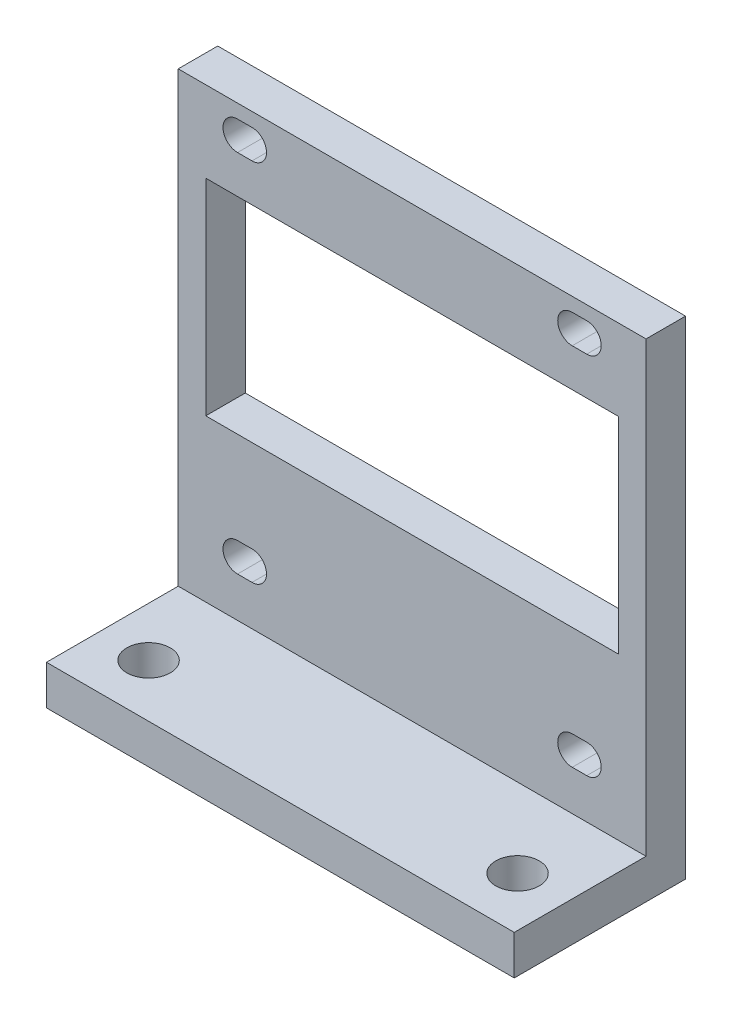
ISO-10303-21;
HEADER;
FILE_DESCRIPTION(('STEP AP214'),'2;1');
FILE_NAME('part.step','',(''),(''),'','','');
FILE_SCHEMA(('AUTOMOTIVE_DESIGN { 1 0 10303 214 1 1 1 1 }'));
ENDSEC;
DATA;
#1=APPLICATION_CONTEXT('core data for automotive mechanical design processes');
#2=APPLICATION_PROTOCOL_DEFINITION('international standard','automotive_design',2000,#1);
#3=PRODUCT_CONTEXT('',#1,'mechanical');
#4=PRODUCT('Part','Part','',(#3));
#5=PRODUCT_RELATED_PRODUCT_CATEGORY('part','',(#4));
#6=PRODUCT_DEFINITION_FORMATION('','',#4);
#7=PRODUCT_DEFINITION_CONTEXT('part definition',#1,'design');
#8=PRODUCT_DEFINITION('design','',#6,#7);
#9=PRODUCT_DEFINITION_SHAPE('','',#8);
#10=(LENGTH_UNIT() NAMED_UNIT(*) SI_UNIT(.MILLI.,.METRE.));
#11=(NAMED_UNIT(*) PLANE_ANGLE_UNIT() SI_UNIT($,.RADIAN.));
#12=(NAMED_UNIT(*) SI_UNIT($,.STERADIAN.) SOLID_ANGLE_UNIT());
#13=UNCERTAINTY_MEASURE_WITH_UNIT(LENGTH_MEASURE(1.E-05),#10,'distance_accuracy_value','');
#14=(GEOMETRIC_REPRESENTATION_CONTEXT(3) GLOBAL_UNCERTAINTY_ASSIGNED_CONTEXT((#13)) GLOBAL_UNIT_ASSIGNED_CONTEXT((#10,
#11,#12)) REPRESENTATION_CONTEXT('',''));
#15=CARTESIAN_POINT('',(0.,0.,0.));
#16=DIRECTION('',(0.,0.,1.));
#17=DIRECTION('',(1.,0.,0.));
#18=AXIS2_PLACEMENT_3D('',#15,#16,#17);
#19=CARTESIAN_POINT('',(0.,0.,3.));
#20=DIRECTION('',(0.,0.,-1.));
#21=DIRECTION('',(-1.,0.,0.));
#22=AXIS2_PLACEMENT_3D('',#19,#20,#21);
#23=PLANE('',#22);
#24=CARTESIAN_POINT('',(29.9000000000003,7.15000000000001,3.));
#25=DIRECTION('',(0.,0.,1.));
#26=DIRECTION('',(1.,0.,0.));
#27=AXIS2_PLACEMENT_3D('',#24,#25,#26);
#28=CIRCLE('',#27,1.1);
#29=CARTESIAN_POINT('',(29.9000000000003,8.25,3.));
#30=VERTEX_POINT('',#29);
#31=CARTESIAN_POINT('',(29.9000000000003,6.05000000000001,3.));
#32=VERTEX_POINT('',#31);
#33=EDGE_CURVE('E347',#30,#32,#28,.T.);
#34=ORIENTED_EDGE('',*,*,#33,.F.);
#35=DIRECTION('',(-1.,0.,0.));
#36=VECTOR('',#35,1.);
#37=CARTESIAN_POINT('',(29.9000000000003,8.25,3.));
#38=LINE('',#37,#36);
#39=CARTESIAN_POINT('',(31.0000000000003,8.25000000000001,3.));
#40=VERTEX_POINT('',#39);
#41=EDGE_CURVE('E360',#40,#30,#38,.T.);
#42=ORIENTED_EDGE('',*,*,#41,.F.);
#43=CARTESIAN_POINT('',(31.0000000000003,7.15000000000001,3.));
#44=DIRECTION('',(0.,0.,1.));
#45=DIRECTION('',(1.,0.,0.));
#46=AXIS2_PLACEMENT_3D('',#43,#44,#45);
#47=CIRCLE('',#46,1.1);
#48=CARTESIAN_POINT('',(31.0000000000003,6.05,3.));
#49=VERTEX_POINT('',#48);
#50=EDGE_CURVE('E354',#49,#40,#47,.T.);
#51=ORIENTED_EDGE('',*,*,#50,.F.);
#52=DIRECTION('',(1.,0.,0.));
#53=VECTOR('',#52,1.);
#54=CARTESIAN_POINT('',(29.9000000000003,6.05000000000001,3.));
#55=LINE('',#54,#53);
#56=EDGE_CURVE('E349',#32,#49,#55,.T.);
#57=ORIENTED_EDGE('',*,*,#56,.F.);
#58=EDGE_LOOP('',(#34,#42,#51,#57));
#59=FACE_BOUND('',#58,.T.);
#60=DIRECTION('',(0.,-1.,0.));
#61=VECTOR('',#60,1.);
#62=CARTESIAN_POINT('',(2.09,15.24,3.));
#63=LINE('',#62,#61);
#64=CARTESIAN_POINT('',(2.09,30.86,3.));
#65=VERTEX_POINT('',#64);
#66=CARTESIAN_POINT('',(2.09,15.24,3.));
#67=VERTEX_POINT('',#66);
#68=EDGE_CURVE('E435',#65,#67,#63,.T.);
#69=ORIENTED_EDGE('',*,*,#68,.F.);
#70=DIRECTION('',(-1.,0.,0.));
#71=VECTOR('',#70,1.);
#72=CARTESIAN_POINT('',(2.09,30.86,3.));
#73=LINE('',#72,#71);
#74=CARTESIAN_POINT('',(33.41,30.86,3.));
#75=VERTEX_POINT('',#74);
#76=EDGE_CURVE('E444',#75,#65,#73,.T.);
#77=ORIENTED_EDGE('',*,*,#76,.F.);
#78=DIRECTION('',(0.,1.,0.));
#79=VECTOR('',#78,1.);
#80=CARTESIAN_POINT('',(33.41,15.24,3.));
#81=LINE('',#80,#79);
#82=CARTESIAN_POINT('',(33.41,15.24,3.));
#83=VERTEX_POINT('',#82);
#84=EDGE_CURVE('E438',#83,#75,#81,.T.);
#85=ORIENTED_EDGE('',*,*,#84,.F.);
#86=DIRECTION('',(1.,0.,0.));
#87=VECTOR('',#86,1.);
#88=CARTESIAN_POINT('',(2.09,15.24,3.));
#89=LINE('',#88,#87);
#90=EDGE_CURVE('E434',#67,#83,#89,.T.);
#91=ORIENTED_EDGE('',*,*,#90,.F.);
#92=EDGE_LOOP('',(#69,#77,#85,#91));
#93=FACE_BOUND('',#92,.T.);
#94=DIRECTION('',(0.,-1.,0.));
#95=VECTOR('',#94,1.);
#96=CARTESIAN_POINT('',(0.,0.,3.));
#97=LINE('',#96,#95);
#98=CARTESIAN_POINT('',(0.,37.,3.));
#99=VERTEX_POINT('',#98);
#100=CARTESIAN_POINT('',(0.,3.,3.));
#101=VERTEX_POINT('',#100);
#102=EDGE_CURVE('E235',#99,#101,#97,.T.);
#103=ORIENTED_EDGE('',*,*,#102,.T.);
#104=DIRECTION('',(1.,0.,0.));
#105=VECTOR('',#104,1.);
#106=CARTESIAN_POINT('',(0.,3.,3.));
#107=LINE('',#106,#105);
#108=CARTESIAN_POINT('',(35.5,3.,3.));
#109=VERTEX_POINT('',#108);
#110=EDGE_CURVE('E217',#101,#109,#107,.T.);
#111=ORIENTED_EDGE('',*,*,#110,.T.);
#112=DIRECTION('',(0.,1.,0.));
#113=VECTOR('',#112,1.);
#114=CARTESIAN_POINT('',(35.5,0.,3.));
#115=LINE('',#114,#113);
#116=CARTESIAN_POINT('',(35.5,37.,3.));
#117=VERTEX_POINT('',#116);
#118=EDGE_CURVE('E249',#109,#117,#115,.T.);
#119=ORIENTED_EDGE('',*,*,#118,.T.);
#120=DIRECTION('',(-1.,0.,0.));
#121=VECTOR('',#120,1.);
#122=CARTESIAN_POINT('',(0.,37.,3.));
#123=LINE('',#122,#121);
#124=EDGE_CURVE('E238',#117,#99,#123,.T.);
#125=ORIENTED_EDGE('',*,*,#124,.T.);
#126=EDGE_LOOP('',(#103,#111,#119,#125));
#127=FACE_BOUND('',#126,.T.);
#128=CARTESIAN_POINT('',(4.5,34.85,3.));
#129=DIRECTION('',(0.,0.,1.));
#130=DIRECTION('',(1.,0.,0.));
#131=AXIS2_PLACEMENT_3D('',#128,#129,#130);
#132=CIRCLE('',#131,1.1);
#133=CARTESIAN_POINT('',(4.5,35.95,3.));
#134=VERTEX_POINT('',#133);
#135=CARTESIAN_POINT('',(4.5,33.75,3.));
#136=VERTEX_POINT('',#135);
#137=EDGE_CURVE('E474',#134,#136,#132,.T.);
#138=ORIENTED_EDGE('',*,*,#137,.F.);
#139=DIRECTION('',(-1.,0.,0.));
#140=VECTOR('',#139,1.);
#141=CARTESIAN_POINT('',(4.5,35.95,3.));
#142=LINE('',#141,#140);
#143=CARTESIAN_POINT('',(5.6,35.95,3.));
#144=VERTEX_POINT('',#143);
#145=EDGE_CURVE('E486',#144,#134,#142,.T.);
#146=ORIENTED_EDGE('',*,*,#145,.F.);
#147=CARTESIAN_POINT('',(5.6,34.85,3.));
#148=DIRECTION('',(0.,0.,1.));
#149=DIRECTION('',(1.,0.,0.));
#150=AXIS2_PLACEMENT_3D('',#147,#148,#149);
#151=CIRCLE('',#150,1.1);
#152=CARTESIAN_POINT('',(5.59999999999999,33.75,3.));
#153=VERTEX_POINT('',#152);
#154=EDGE_CURVE('E485',#153,#144,#151,.T.);
#155=ORIENTED_EDGE('',*,*,#154,.F.);
#156=DIRECTION('',(1.,0.,0.));
#157=VECTOR('',#156,1.);
#158=CARTESIAN_POINT('',(4.5,33.75,3.));
#159=LINE('',#158,#157);
#160=EDGE_CURVE('E476',#136,#153,#159,.T.);
#161=ORIENTED_EDGE('',*,*,#160,.F.);
#162=EDGE_LOOP('',(#138,#146,#155,#161));
#163=FACE_BOUND('',#162,.T.);
#164=CARTESIAN_POINT('',(29.9,34.85,3.));
#165=DIRECTION('',(0.,0.,1.));
#166=DIRECTION('',(1.,0.,0.));
#167=AXIS2_PLACEMENT_3D('',#164,#165,#166);
#168=CIRCLE('',#167,1.1);
#169=CARTESIAN_POINT('',(29.9,35.95,3.));
#170=VERTEX_POINT('',#169);
#171=CARTESIAN_POINT('',(29.9,33.75,3.));
#172=VERTEX_POINT('',#171);
#173=EDGE_CURVE('E386',#170,#172,#168,.T.);
#174=ORIENTED_EDGE('',*,*,#173,.F.);
#175=DIRECTION('',(-1.,0.,0.));
#176=VECTOR('',#175,1.);
#177=CARTESIAN_POINT('',(29.9,35.95,3.));
#178=LINE('',#177,#176);
#179=CARTESIAN_POINT('',(31.,35.95,3.));
#180=VERTEX_POINT('',#179);
#181=EDGE_CURVE('E399',#180,#170,#178,.T.);
#182=ORIENTED_EDGE('',*,*,#181,.F.);
#183=CARTESIAN_POINT('',(31.,34.85,3.));
#184=DIRECTION('',(0.,0.,1.));
#185=DIRECTION('',(1.,0.,0.));
#186=AXIS2_PLACEMENT_3D('',#183,#184,#185);
#187=CIRCLE('',#186,1.10000000000001);
#188=CARTESIAN_POINT('',(31.,33.75,3.));
#189=VERTEX_POINT('',#188);
#190=EDGE_CURVE('E396',#189,#180,#187,.T.);
#191=ORIENTED_EDGE('',*,*,#190,.F.);
#192=DIRECTION('',(1.,0.,0.));
#193=VECTOR('',#192,1.);
#194=CARTESIAN_POINT('',(29.9,33.75,3.));
#195=LINE('',#194,#193);
#196=EDGE_CURVE('E395',#172,#189,#195,.T.);
#197=ORIENTED_EDGE('',*,*,#196,.F.);
#198=EDGE_LOOP('',(#174,#182,#191,#197));
#199=FACE_BOUND('',#198,.T.);
#200=CARTESIAN_POINT('',(4.50000000000029,7.15000000000001,3.));
#201=DIRECTION('',(0.,0.,1.));
#202=DIRECTION('',(1.,0.,0.));
#203=AXIS2_PLACEMENT_3D('',#200,#201,#202);
#204=CIRCLE('',#203,1.1);
#205=CARTESIAN_POINT('',(4.50000000000029,8.25,3.));
#206=VERTEX_POINT('',#205);
#207=CARTESIAN_POINT('',(4.50000000000029,6.05000000000001,3.));
#208=VERTEX_POINT('',#207);
#209=EDGE_CURVE('E304',#206,#208,#204,.T.);
#210=ORIENTED_EDGE('',*,*,#209,.F.);
#211=DIRECTION('',(-1.,0.,0.));
#212=VECTOR('',#211,1.);
#213=CARTESIAN_POINT('',(4.50000000000029,8.25,3.));
#214=LINE('',#213,#212);
#215=CARTESIAN_POINT('',(5.60000000000029,8.25000000000001,3.));
#216=VERTEX_POINT('',#215);
#217=EDGE_CURVE('E312',#216,#206,#214,.T.);
#218=ORIENTED_EDGE('',*,*,#217,.F.);
#219=CARTESIAN_POINT('',(5.60000000000029,7.15000000000001,3.));
#220=DIRECTION('',(0.,0.,1.));
#221=DIRECTION('',(1.,0.,0.));
#222=AXIS2_PLACEMENT_3D('',#219,#220,#221);
#223=CIRCLE('',#222,1.1);
#224=CARTESIAN_POINT('',(5.60000000000029,6.05,3.));
#225=VERTEX_POINT('',#224);
#226=EDGE_CURVE('E315',#225,#216,#223,.T.);
#227=ORIENTED_EDGE('',*,*,#226,.F.);
#228=DIRECTION('',(1.,0.,0.));
#229=VECTOR('',#228,1.);
#230=CARTESIAN_POINT('',(4.50000000000029,6.05000000000001,3.));
#231=LINE('',#230,#229);
#232=EDGE_CURVE('E306',#208,#225,#231,.T.);
#233=ORIENTED_EDGE('',*,*,#232,.F.);
#234=EDGE_LOOP('',(#210,#218,#227,#233));
#235=FACE_BOUND('',#234,.T.);
#236=ADVANCED_FACE('F44',(#59,#93,#127,#163,#199,#235),#23,.F.);
#237=CARTESIAN_POINT('',(0.,0.,0.));
#238=DIRECTION('',(0.,0.,-1.));
#239=DIRECTION('',(-1.,0.,0.));
#240=AXIS2_PLACEMENT_3D('',#237,#238,#239);
#241=PLANE('',#240);
#242=DIRECTION('',(0.,1.,0.));
#243=VECTOR('',#242,1.);
#244=CARTESIAN_POINT('',(35.5,0.,0.));
#245=LINE('',#244,#243);
#246=CARTESIAN_POINT('',(35.5,0.,0.));
#247=VERTEX_POINT('',#246);
#248=CARTESIAN_POINT('',(35.5,37.,0.));
#249=VERTEX_POINT('',#248);
#250=EDGE_CURVE('E255',#247,#249,#245,.T.);
#251=ORIENTED_EDGE('',*,*,#250,.F.);
#252=DIRECTION('',(1.,0.,0.));
#253=VECTOR('',#252,1.);
#254=CARTESIAN_POINT('',(0.,0.,0.));
#255=LINE('',#254,#253);
#256=CARTESIAN_POINT('',(0.,0.,0.));
#257=VERTEX_POINT('',#256);
#258=EDGE_CURVE('E264',#257,#247,#255,.T.);
#259=ORIENTED_EDGE('',*,*,#258,.F.);
#260=DIRECTION('',(0.,-1.,0.));
#261=VECTOR('',#260,1.);
#262=CARTESIAN_POINT('',(0.,0.,0.));
#263=LINE('',#262,#261);
#264=CARTESIAN_POINT('',(0.,37.,0.));
#265=VERTEX_POINT('',#264);
#266=EDGE_CURVE('E265',#265,#257,#263,.T.);
#267=ORIENTED_EDGE('',*,*,#266,.F.);
#268=DIRECTION('',(-1.,0.,0.));
#269=VECTOR('',#268,1.);
#270=CARTESIAN_POINT('',(0.,37.,0.));
#271=LINE('',#270,#269);
#272=EDGE_CURVE('E256',#249,#265,#271,.T.);
#273=ORIENTED_EDGE('',*,*,#272,.F.);
#274=EDGE_LOOP('',(#251,#259,#267,#273));
#275=FACE_BOUND('',#274,.T.);
#276=DIRECTION('',(-1.,0.,0.));
#277=VECTOR('',#276,1.);
#278=CARTESIAN_POINT('',(4.5,35.95,0.));
#279=LINE('',#278,#277);
#280=CARTESIAN_POINT('',(5.6,35.95,0.));
#281=VERTEX_POINT('',#280);
#282=CARTESIAN_POINT('',(4.5,35.95,0.));
#283=VERTEX_POINT('',#282);
#284=EDGE_CURVE('E479',#281,#283,#279,.T.);
#285=ORIENTED_EDGE('',*,*,#284,.T.);
#286=CARTESIAN_POINT('',(4.5,34.85,0.));
#287=DIRECTION('',(0.,0.,1.));
#288=DIRECTION('',(1.,0.,0.));
#289=AXIS2_PLACEMENT_3D('',#286,#287,#288);
#290=CIRCLE('',#289,1.1);
#291=CARTESIAN_POINT('',(4.5,33.75,0.));
#292=VERTEX_POINT('',#291);
#293=EDGE_CURVE('E475',#283,#292,#290,.T.);
#294=ORIENTED_EDGE('',*,*,#293,.T.);
#295=DIRECTION('',(1.,0.,0.));
#296=VECTOR('',#295,1.);
#297=CARTESIAN_POINT('',(4.5,33.75,0.));
#298=LINE('',#297,#296);
#299=CARTESIAN_POINT('',(5.59999999999999,33.75,0.));
#300=VERTEX_POINT('',#299);
#301=EDGE_CURVE('E492',#292,#300,#298,.T.);
#302=ORIENTED_EDGE('',*,*,#301,.T.);
#303=CARTESIAN_POINT('',(5.6,34.85,0.));
#304=DIRECTION('',(0.,0.,1.));
#305=DIRECTION('',(1.,0.,0.));
#306=AXIS2_PLACEMENT_3D('',#303,#304,#305);
#307=CIRCLE('',#306,1.1);
#308=EDGE_CURVE('E500',#300,#281,#307,.T.);
#309=ORIENTED_EDGE('',*,*,#308,.T.);
#310=EDGE_LOOP('',(#285,#294,#302,#309));
#311=FACE_BOUND('',#310,.T.);
#312=DIRECTION('',(-1.,0.,0.));
#313=VECTOR('',#312,1.);
#314=CARTESIAN_POINT('',(2.09,30.86,0.));
#315=LINE('',#314,#313);
#316=CARTESIAN_POINT('',(33.41,30.86,0.));
#317=VERTEX_POINT('',#316);
#318=CARTESIAN_POINT('',(2.09,30.86,0.));
#319=VERTEX_POINT('',#318);
#320=EDGE_CURVE('E436',#317,#319,#315,.T.);
#321=ORIENTED_EDGE('',*,*,#320,.T.);
#322=DIRECTION('',(0.,-1.,0.));
#323=VECTOR('',#322,1.);
#324=CARTESIAN_POINT('',(2.09,15.24,0.));
#325=LINE('',#324,#323);
#326=CARTESIAN_POINT('',(2.09,15.24,0.));
#327=VERTEX_POINT('',#326);
#328=EDGE_CURVE('E431',#319,#327,#325,.T.);
#329=ORIENTED_EDGE('',*,*,#328,.T.);
#330=DIRECTION('',(1.,0.,0.));
#331=VECTOR('',#330,1.);
#332=CARTESIAN_POINT('',(2.09,15.24,0.));
#333=LINE('',#332,#331);
#334=CARTESIAN_POINT('',(33.41,15.24,0.));
#335=VERTEX_POINT('',#334);
#336=EDGE_CURVE('E448',#327,#335,#333,.T.);
#337=ORIENTED_EDGE('',*,*,#336,.T.);
#338=DIRECTION('',(0.,1.,0.));
#339=VECTOR('',#338,1.);
#340=CARTESIAN_POINT('',(33.41,15.24,0.));
#341=LINE('',#340,#339);
#342=EDGE_CURVE('E452',#335,#317,#341,.T.);
#343=ORIENTED_EDGE('',*,*,#342,.T.);
#344=EDGE_LOOP('',(#321,#329,#337,#343));
#345=FACE_BOUND('',#344,.T.);
#346=DIRECTION('',(-1.,0.,0.));
#347=VECTOR('',#346,1.);
#348=CARTESIAN_POINT('',(29.9,35.95,0.));
#349=LINE('',#348,#347);
#350=CARTESIAN_POINT('',(31.,35.95,0.));
#351=VERTEX_POINT('',#350);
#352=CARTESIAN_POINT('',(29.9,35.95,0.));
#353=VERTEX_POINT('',#352);
#354=EDGE_CURVE('E394',#351,#353,#349,.T.);
#355=ORIENTED_EDGE('',*,*,#354,.T.);
#356=CARTESIAN_POINT('',(29.9,34.85,0.));
#357=DIRECTION('',(0.,0.,1.));
#358=DIRECTION('',(1.,0.,0.));
#359=AXIS2_PLACEMENT_3D('',#356,#357,#358);
#360=CIRCLE('',#359,1.1);
#361=CARTESIAN_POINT('',(29.9,33.75,0.));
#362=VERTEX_POINT('',#361);
#363=EDGE_CURVE('E389',#353,#362,#360,.T.);
#364=ORIENTED_EDGE('',*,*,#363,.T.);
#365=DIRECTION('',(1.,0.,0.));
#366=VECTOR('',#365,1.);
#367=CARTESIAN_POINT('',(29.9,33.75,0.));
#368=LINE('',#367,#366);
#369=CARTESIAN_POINT('',(31.,33.75,0.));
#370=VERTEX_POINT('',#369);
#371=EDGE_CURVE('E410',#362,#370,#368,.T.);
#372=ORIENTED_EDGE('',*,*,#371,.T.);
#373=CARTESIAN_POINT('',(31.,34.85,0.));
#374=DIRECTION('',(0.,0.,1.));
#375=DIRECTION('',(1.,0.,0.));
#376=AXIS2_PLACEMENT_3D('',#373,#374,#375);
#377=CIRCLE('',#376,1.10000000000001);
#378=EDGE_CURVE('E411',#370,#351,#377,.T.);
#379=ORIENTED_EDGE('',*,*,#378,.T.);
#380=EDGE_LOOP('',(#355,#364,#372,#379));
#381=FACE_BOUND('',#380,.T.);
#382=DIRECTION('',(-1.,0.,0.));
#383=VECTOR('',#382,1.);
#384=CARTESIAN_POINT('',(29.9000000000003,8.25,0.));
#385=LINE('',#384,#383);
#386=CARTESIAN_POINT('',(31.0000000000003,8.25000000000001,0.));
#387=VERTEX_POINT('',#386);
#388=CARTESIAN_POINT('',(29.9000000000003,8.25,0.));
#389=VERTEX_POINT('',#388);
#390=EDGE_CURVE('E348',#387,#389,#385,.T.);
#391=ORIENTED_EDGE('',*,*,#390,.T.);
#392=CARTESIAN_POINT('',(29.9000000000003,7.15000000000001,0.));
#393=DIRECTION('',(0.,0.,1.));
#394=DIRECTION('',(1.,0.,0.));
#395=AXIS2_PLACEMENT_3D('',#392,#393,#394);
#396=CIRCLE('',#395,1.1);
#397=CARTESIAN_POINT('',(29.9000000000003,6.05000000000001,0.));
#398=VERTEX_POINT('',#397);
#399=EDGE_CURVE('E344',#389,#398,#396,.T.);
#400=ORIENTED_EDGE('',*,*,#399,.T.);
#401=DIRECTION('',(1.,0.,0.));
#402=VECTOR('',#401,1.);
#403=CARTESIAN_POINT('',(29.9000000000003,6.05000000000001,0.));
#404=LINE('',#403,#402);
#405=CARTESIAN_POINT('',(31.0000000000003,6.05,0.));
#406=VERTEX_POINT('',#405);
#407=EDGE_CURVE('E365',#398,#406,#404,.T.);
#408=ORIENTED_EDGE('',*,*,#407,.T.);
#409=CARTESIAN_POINT('',(31.0000000000003,7.15000000000001,0.));
#410=DIRECTION('',(0.,0.,1.));
#411=DIRECTION('',(1.,0.,0.));
#412=AXIS2_PLACEMENT_3D('',#409,#410,#411);
#413=CIRCLE('',#412,1.1);
#414=EDGE_CURVE('E366',#406,#387,#413,.T.);
#415=ORIENTED_EDGE('',*,*,#414,.T.);
#416=EDGE_LOOP('',(#391,#400,#408,#415));
#417=FACE_BOUND('',#416,.T.);
#418=DIRECTION('',(-1.,0.,0.));
#419=VECTOR('',#418,1.);
#420=CARTESIAN_POINT('',(4.50000000000029,8.25,0.));
#421=LINE('',#420,#419);
#422=CARTESIAN_POINT('',(5.60000000000029,8.25000000000001,0.));
#423=VERTEX_POINT('',#422);
#424=CARTESIAN_POINT('',(4.50000000000029,8.25,0.));
#425=VERTEX_POINT('',#424);
#426=EDGE_CURVE('E310',#423,#425,#421,.T.);
#427=ORIENTED_EDGE('',*,*,#426,.T.);
#428=CARTESIAN_POINT('',(4.50000000000029,7.15000000000001,0.));
#429=DIRECTION('',(0.,0.,1.));
#430=DIRECTION('',(1.,0.,0.));
#431=AXIS2_PLACEMENT_3D('',#428,#429,#430);
#432=CIRCLE('',#431,1.1);
#433=CARTESIAN_POINT('',(4.50000000000029,6.05000000000001,0.));
#434=VERTEX_POINT('',#433);
#435=EDGE_CURVE('E303',#425,#434,#432,.T.);
#436=ORIENTED_EDGE('',*,*,#435,.T.);
#437=DIRECTION('',(1.,0.,0.));
#438=VECTOR('',#437,1.);
#439=CARTESIAN_POINT('',(4.50000000000029,6.05000000000001,0.));
#440=LINE('',#439,#438);
#441=CARTESIAN_POINT('',(5.60000000000029,6.05,0.));
#442=VERTEX_POINT('',#441);
#443=EDGE_CURVE('E325',#434,#442,#440,.T.);
#444=ORIENTED_EDGE('',*,*,#443,.T.);
#445=CARTESIAN_POINT('',(5.60000000000029,7.15000000000001,0.));
#446=DIRECTION('',(0.,0.,1.));
#447=DIRECTION('',(1.,0.,0.));
#448=AXIS2_PLACEMENT_3D('',#445,#446,#447);
#449=CIRCLE('',#448,1.1);
#450=EDGE_CURVE('E326',#442,#423,#449,.T.);
#451=ORIENTED_EDGE('',*,*,#450,.T.);
#452=EDGE_LOOP('',(#427,#436,#444,#451));
#453=FACE_BOUND('',#452,.T.);
#454=ADVANCED_FACE('F277',(#275,#311,#345,#381,#417,#453),#241,.T.);
#455=CARTESIAN_POINT('',(35.5,0.,3.));
#456=DIRECTION('',(-1.,0.,0.));
#457=DIRECTION('',(0.,-1.,0.));
#458=AXIS2_PLACEMENT_3D('',#455,#456,#457);
#459=PLANE('',#458);
#460=ORIENTED_EDGE('',*,*,#250,.T.);
#461=DIRECTION('',(0.,0.,-1.));
#462=VECTOR('',#461,1.);
#463=CARTESIAN_POINT('',(35.5,37.,3.));
#464=LINE('',#463,#462);
#465=EDGE_CURVE('E11',#117,#249,#464,.T.);
#466=ORIENTED_EDGE('',*,*,#465,.F.);
#467=ORIENTED_EDGE('',*,*,#118,.F.);
#468=DIRECTION('',(0.,0.,1.));
#469=VECTOR('',#468,1.);
#470=CARTESIAN_POINT('',(35.5,3.,3.));
#471=LINE('',#470,#469);
#472=CARTESIAN_POINT('',(35.5,3.,13.));
#473=VERTEX_POINT('',#472);
#474=EDGE_CURVE('E62',#109,#473,#471,.T.);
#475=ORIENTED_EDGE('',*,*,#474,.T.);
#476=DIRECTION('',(0.,-1.,0.));
#477=VECTOR('',#476,1.);
#478=CARTESIAN_POINT('',(35.5,3.,13.));
#479=LINE('',#478,#477);
#480=CARTESIAN_POINT('',(35.5,0.,13.));
#481=VERTEX_POINT('',#480);
#482=EDGE_CURVE('E283',#473,#481,#479,.T.);
#483=ORIENTED_EDGE('',*,*,#482,.T.);
#484=DIRECTION('',(0.,0.,-1.));
#485=VECTOR('',#484,1.);
#486=CARTESIAN_POINT('',(35.5,0.,3.));
#487=LINE('',#486,#485);
#488=EDGE_CURVE('E244',#481,#247,#487,.T.);
#489=ORIENTED_EDGE('',*,*,#488,.T.);
#490=EDGE_LOOP('',(#460,#466,#467,#475,#483,#489));
#491=FACE_BOUND('',#490,.T.);
#492=ADVANCED_FACE('F50',(#491),#459,.F.);
#493=CARTESIAN_POINT('',(0.,37.,3.));
#494=DIRECTION('',(0.,-1.,0.));
#495=DIRECTION('',(0.,0.,-1.));
#496=AXIS2_PLACEMENT_3D('',#493,#494,#495);
#497=PLANE('',#496);
#498=ORIENTED_EDGE('',*,*,#272,.T.);
#499=DIRECTION('',(0.,0.,-1.));
#500=VECTOR('',#499,1.);
#501=CARTESIAN_POINT('',(0.,37.,3.));
#502=LINE('',#501,#500);
#503=EDGE_CURVE('E53',#99,#265,#502,.T.);
#504=ORIENTED_EDGE('',*,*,#503,.F.);
#505=ORIENTED_EDGE('',*,*,#124,.F.);
#506=ORIENTED_EDGE('',*,*,#465,.T.);
#507=EDGE_LOOP('',(#498,#504,#505,#506));
#508=FACE_BOUND('',#507,.T.);
#509=ADVANCED_FACE('F517',(#508),#497,.F.);
#510=CARTESIAN_POINT('',(0.,0.,3.));
#511=DIRECTION('',(1.,0.,0.));
#512=DIRECTION('',(0.,0.,-1.));
#513=AXIS2_PLACEMENT_3D('',#510,#511,#512);
#514=PLANE('',#513);
#515=ORIENTED_EDGE('',*,*,#266,.T.);
#516=DIRECTION('',(0.,0.,-1.));
#517=VECTOR('',#516,1.);
#518=CARTESIAN_POINT('',(0.,0.,3.));
#519=LINE('',#518,#517);
#520=CARTESIAN_POINT('',(0.,0.,13.));
#521=VERTEX_POINT('',#520);
#522=EDGE_CURVE('E248',#521,#257,#519,.T.);
#523=ORIENTED_EDGE('',*,*,#522,.F.);
#524=DIRECTION('',(0.,-1.,0.));
#525=VECTOR('',#524,1.);
#526=CARTESIAN_POINT('',(0.,3.,13.));
#527=LINE('',#526,#525);
#528=CARTESIAN_POINT('',(0.,3.,13.));
#529=VERTEX_POINT('',#528);
#530=EDGE_CURVE('E232',#529,#521,#527,.T.);
#531=ORIENTED_EDGE('',*,*,#530,.F.);
#532=DIRECTION('',(0.,0.,-1.));
#533=VECTOR('',#532,1.);
#534=CARTESIAN_POINT('',(0.,3.,3.));
#535=LINE('',#534,#533);
#536=EDGE_CURVE('E222',#529,#101,#535,.T.);
#537=ORIENTED_EDGE('',*,*,#536,.T.);
#538=ORIENTED_EDGE('',*,*,#102,.F.);
#539=ORIENTED_EDGE('',*,*,#503,.T.);
#540=EDGE_LOOP('',(#515,#523,#531,#537,#538,#539));
#541=FACE_BOUND('',#540,.T.);
#542=ADVANCED_FACE('F228',(#541),#514,.F.);
#543=CARTESIAN_POINT('',(0.,0.,3.));
#544=DIRECTION('',(0.,1.,0.));
#545=DIRECTION('',(0.,0.,1.));
#546=AXIS2_PLACEMENT_3D('',#543,#544,#545);
#547=PLANE('',#546);
#548=ORIENTED_EDGE('',*,*,#258,.T.);
#549=ORIENTED_EDGE('',*,*,#488,.F.);
#550=DIRECTION('',(-1.,0.,0.));
#551=VECTOR('',#550,1.);
#552=CARTESIAN_POINT('',(0.,0.,13.));
#553=LINE('',#552,#551);
#554=EDGE_CURVE('E237',#481,#521,#553,.T.);
#555=ORIENTED_EDGE('',*,*,#554,.T.);
#556=ORIENTED_EDGE('',*,*,#522,.T.);
#557=EDGE_LOOP('',(#548,#549,#555,#556));
#558=FACE_BOUND('',#557,.T.);
#559=CARTESIAN_POINT('',(31.75,0.,9.));
#560=DIRECTION('',(0.,-1.,0.));
#561=DIRECTION('',(0.,0.,-1.));
#562=AXIS2_PLACEMENT_3D('',#559,#560,#561);
#563=CIRCLE('',#562,1.65);
#564=CARTESIAN_POINT('',(31.75,0.,7.35));
#565=VERTEX_POINT('',#564);
#566=EDGE_CURVE('E803',#565,#565,#563,.T.);
#567=ORIENTED_EDGE('',*,*,#566,.F.);
#568=EDGE_LOOP('',(#567));
#569=FACE_BOUND('',#568,.T.);
#570=CARTESIAN_POINT('',(3.75,0.,9.));
#571=DIRECTION('',(0.,-1.,0.));
#572=DIRECTION('',(0.,0.,-1.));
#573=AXIS2_PLACEMENT_3D('',#570,#571,#572);
#574=CIRCLE('',#573,1.65);
#575=CARTESIAN_POINT('',(3.75,0.,7.35));
#576=VERTEX_POINT('',#575);
#577=EDGE_CURVE('E300',#576,#576,#574,.T.);
#578=ORIENTED_EDGE('',*,*,#577,.F.);
#579=EDGE_LOOP('',(#578));
#580=FACE_BOUND('',#579,.T.);
#581=ADVANCED_FACE('F276',(#558,#569,#580),#547,.F.);
#582=CARTESIAN_POINT('',(4.5,34.85,3.));
#583=DIRECTION('',(0.,0.,-1.));
#584=DIRECTION('',(-1.,0.,0.));
#585=AXIS2_PLACEMENT_3D('',#582,#583,#584);
#586=CYLINDRICAL_SURFACE('',#585,1.1);
#587=ORIENTED_EDGE('',*,*,#293,.F.);
#588=DIRECTION('',(0.,0.,-1.));
#589=VECTOR('',#588,1.);
#590=CARTESIAN_POINT('',(4.5,35.95,3.));
#591=LINE('',#590,#589);
#592=EDGE_CURVE('E487',#134,#283,#591,.T.);
#593=ORIENTED_EDGE('',*,*,#592,.F.);
#594=ORIENTED_EDGE('',*,*,#137,.T.);
#595=DIRECTION('',(0.,0.,-1.));
#596=VECTOR('',#595,1.);
#597=CARTESIAN_POINT('',(4.5,33.75,3.));
#598=LINE('',#597,#596);
#599=EDGE_CURVE('E259',#136,#292,#598,.T.);
#600=ORIENTED_EDGE('',*,*,#599,.T.);
#601=EDGE_LOOP('',(#587,#593,#594,#600));
#602=FACE_BOUND('',#601,.T.);
#603=ADVANCED_FACE('F532',(#602),#586,.F.);
#604=CARTESIAN_POINT('',(4.5,33.75,3.));
#605=DIRECTION('',(0.,1.,0.));
#606=DIRECTION('',(0.,0.,1.));
#607=AXIS2_PLACEMENT_3D('',#604,#605,#606);
#608=PLANE('',#607);
#609=ORIENTED_EDGE('',*,*,#301,.F.);
#610=ORIENTED_EDGE('',*,*,#599,.F.);
#611=ORIENTED_EDGE('',*,*,#160,.T.);
#612=DIRECTION('',(0.,0.,-1.));
#613=VECTOR('',#612,1.);
#614=CARTESIAN_POINT('',(5.59999999999999,33.75,3.));
#615=LINE('',#614,#613);
#616=EDGE_CURVE('E509',#153,#300,#615,.T.);
#617=ORIENTED_EDGE('',*,*,#616,.T.);
#618=EDGE_LOOP('',(#609,#610,#611,#617));
#619=FACE_BOUND('',#618,.T.);
#620=ADVANCED_FACE('F545',(#619),#608,.T.);
#621=CARTESIAN_POINT('',(5.6,34.85,3.));
#622=DIRECTION('',(0.,0.,-1.));
#623=DIRECTION('',(-1.,0.,0.));
#624=AXIS2_PLACEMENT_3D('',#621,#622,#623);
#625=CYLINDRICAL_SURFACE('',#624,1.1);
#626=ORIENTED_EDGE('',*,*,#308,.F.);
#627=ORIENTED_EDGE('',*,*,#616,.F.);
#628=ORIENTED_EDGE('',*,*,#154,.T.);
#629=DIRECTION('',(0.,0.,-1.));
#630=VECTOR('',#629,1.);
#631=CARTESIAN_POINT('',(5.6,35.95,3.));
#632=LINE('',#631,#630);
#633=EDGE_CURVE('E510',#144,#281,#632,.T.);
#634=ORIENTED_EDGE('',*,*,#633,.T.);
#635=EDGE_LOOP('',(#626,#627,#628,#634));
#636=FACE_BOUND('',#635,.T.);
#637=ADVANCED_FACE('F550',(#636),#625,.F.);
#638=CARTESIAN_POINT('',(4.5,35.95,3.));
#639=DIRECTION('',(0.,-1.,0.));
#640=DIRECTION('',(0.,0.,-1.));
#641=AXIS2_PLACEMENT_3D('',#638,#639,#640);
#642=PLANE('',#641);
#643=ORIENTED_EDGE('',*,*,#284,.F.);
#644=ORIENTED_EDGE('',*,*,#633,.F.);
#645=ORIENTED_EDGE('',*,*,#145,.T.);
#646=ORIENTED_EDGE('',*,*,#592,.T.);
#647=EDGE_LOOP('',(#643,#644,#645,#646));
#648=FACE_BOUND('',#647,.T.);
#649=ADVANCED_FACE('F551',(#648),#642,.T.);
#650=CARTESIAN_POINT('',(2.09,15.24,3.));
#651=DIRECTION('',(1.,0.,0.));
#652=DIRECTION('',(0.,0.,-1.));
#653=AXIS2_PLACEMENT_3D('',#650,#651,#652);
#654=PLANE('',#653);
#655=ORIENTED_EDGE('',*,*,#328,.F.);
#656=DIRECTION('',(0.,0.,-1.));
#657=VECTOR('',#656,1.);
#658=CARTESIAN_POINT('',(2.09,30.86,3.));
#659=LINE('',#658,#657);
#660=EDGE_CURVE('E447',#65,#319,#659,.T.);
#661=ORIENTED_EDGE('',*,*,#660,.F.);
#662=ORIENTED_EDGE('',*,*,#68,.T.);
#663=DIRECTION('',(0.,0.,-1.));
#664=VECTOR('',#663,1.);
#665=CARTESIAN_POINT('',(2.09,15.24,3.));
#666=LINE('',#665,#664);
#667=EDGE_CURVE('E469',#67,#327,#666,.T.);
#668=ORIENTED_EDGE('',*,*,#667,.T.);
#669=EDGE_LOOP('',(#655,#661,#662,#668));
#670=FACE_BOUND('',#669,.T.);
#671=ADVANCED_FACE('F636',(#670),#654,.T.);
#672=CARTESIAN_POINT('',(2.09,15.24,3.));
#673=DIRECTION('',(0.,1.,0.));
#674=DIRECTION('',(0.,0.,1.));
#675=AXIS2_PLACEMENT_3D('',#672,#673,#674);
#676=PLANE('',#675);
#677=ORIENTED_EDGE('',*,*,#336,.F.);
#678=ORIENTED_EDGE('',*,*,#667,.F.);
#679=ORIENTED_EDGE('',*,*,#90,.T.);
#680=DIRECTION('',(0.,0.,-1.));
#681=VECTOR('',#680,1.);
#682=CARTESIAN_POINT('',(33.41,15.24,3.));
#683=LINE('',#682,#681);
#684=EDGE_CURVE('E470',#83,#335,#683,.T.);
#685=ORIENTED_EDGE('',*,*,#684,.T.);
#686=EDGE_LOOP('',(#677,#678,#679,#685));
#687=FACE_BOUND('',#686,.T.);
#688=ADVANCED_FACE('F632',(#687),#676,.T.);
#689=CARTESIAN_POINT('',(33.41,15.24,3.));
#690=DIRECTION('',(-1.,0.,0.));
#691=DIRECTION('',(0.,0.,1.));
#692=AXIS2_PLACEMENT_3D('',#689,#690,#691);
#693=PLANE('',#692);
#694=ORIENTED_EDGE('',*,*,#342,.F.);
#695=ORIENTED_EDGE('',*,*,#684,.F.);
#696=ORIENTED_EDGE('',*,*,#84,.T.);
#697=DIRECTION('',(0.,0.,-1.));
#698=VECTOR('',#697,1.);
#699=CARTESIAN_POINT('',(33.41,30.86,3.));
#700=LINE('',#699,#698);
#701=EDGE_CURVE('E461',#75,#317,#700,.T.);
#702=ORIENTED_EDGE('',*,*,#701,.T.);
#703=EDGE_LOOP('',(#694,#695,#696,#702));
#704=FACE_BOUND('',#703,.T.);
#705=ADVANCED_FACE('F628',(#704),#693,.T.);
#706=CARTESIAN_POINT('',(2.09,30.86,3.));
#707=DIRECTION('',(0.,-1.,0.));
#708=DIRECTION('',(0.,0.,-1.));
#709=AXIS2_PLACEMENT_3D('',#706,#707,#708);
#710=PLANE('',#709);
#711=ORIENTED_EDGE('',*,*,#320,.F.);
#712=ORIENTED_EDGE('',*,*,#701,.F.);
#713=ORIENTED_EDGE('',*,*,#76,.T.);
#714=ORIENTED_EDGE('',*,*,#660,.T.);
#715=EDGE_LOOP('',(#711,#712,#713,#714));
#716=FACE_BOUND('',#715,.T.);
#717=ADVANCED_FACE('F627',(#716),#710,.T.);
#718=CARTESIAN_POINT('',(29.9,34.85,3.));
#719=DIRECTION('',(0.,0.,-1.));
#720=DIRECTION('',(-1.,0.,0.));
#721=AXIS2_PLACEMENT_3D('',#718,#719,#720);
#722=CYLINDRICAL_SURFACE('',#721,1.1);
#723=ORIENTED_EDGE('',*,*,#363,.F.);
#724=DIRECTION('',(0.,0.,-1.));
#725=VECTOR('',#724,1.);
#726=CARTESIAN_POINT('',(29.9,35.95,3.));
#727=LINE('',#726,#725);
#728=EDGE_CURVE('E401',#170,#353,#727,.T.);
#729=ORIENTED_EDGE('',*,*,#728,.F.);
#730=ORIENTED_EDGE('',*,*,#173,.T.);
#731=DIRECTION('',(0.,0.,-1.));
#732=VECTOR('',#731,1.);
#733=CARTESIAN_POINT('',(29.9,33.75,3.));
#734=LINE('',#733,#732);
#735=EDGE_CURVE('E430',#172,#362,#734,.T.);
#736=ORIENTED_EDGE('',*,*,#735,.T.);
#737=EDGE_LOOP('',(#723,#729,#730,#736));
#738=FACE_BOUND('',#737,.T.);
#739=ADVANCED_FACE('F625',(#738),#722,.F.);
#740=CARTESIAN_POINT('',(29.9,33.75,3.));
#741=DIRECTION('',(0.,1.,0.));
#742=DIRECTION('',(-1.,0.,0.));
#743=AXIS2_PLACEMENT_3D('',#740,#741,#742);
#744=PLANE('',#743);
#745=ORIENTED_EDGE('',*,*,#371,.F.);
#746=ORIENTED_EDGE('',*,*,#735,.F.);
#747=ORIENTED_EDGE('',*,*,#196,.T.);
#748=DIRECTION('',(0.,0.,-1.));
#749=VECTOR('',#748,1.);
#750=CARTESIAN_POINT('',(31.,33.75,3.));
#751=LINE('',#750,#749);
#752=EDGE_CURVE('E424',#189,#370,#751,.T.);
#753=ORIENTED_EDGE('',*,*,#752,.T.);
#754=EDGE_LOOP('',(#745,#746,#747,#753));
#755=FACE_BOUND('',#754,.T.);
#756=ADVANCED_FACE('F618',(#755),#744,.T.);
#757=CARTESIAN_POINT('',(31.,34.85,3.));
#758=DIRECTION('',(0.,0.,-1.));
#759=DIRECTION('',(-1.,0.,0.));
#760=AXIS2_PLACEMENT_3D('',#757,#758,#759);
#761=CYLINDRICAL_SURFACE('',#760,1.10000000000001);
#762=ORIENTED_EDGE('',*,*,#378,.F.);
#763=ORIENTED_EDGE('',*,*,#752,.F.);
#764=ORIENTED_EDGE('',*,*,#190,.T.);
#765=DIRECTION('',(0.,0.,-1.));
#766=VECTOR('',#765,1.);
#767=CARTESIAN_POINT('',(31.,35.95,3.));
#768=LINE('',#767,#766);
#769=EDGE_CURVE('E423',#180,#351,#768,.T.);
#770=ORIENTED_EDGE('',*,*,#769,.T.);
#771=EDGE_LOOP('',(#762,#763,#764,#770));
#772=FACE_BOUND('',#771,.T.);
#773=ADVANCED_FACE('F611',(#772),#761,.F.);
#774=CARTESIAN_POINT('',(29.9,35.95,3.));
#775=DIRECTION('',(0.,-1.,0.));
#776=DIRECTION('',(1.,0.,0.));
#777=AXIS2_PLACEMENT_3D('',#774,#775,#776);
#778=PLANE('',#777);
#779=ORIENTED_EDGE('',*,*,#354,.F.);
#780=ORIENTED_EDGE('',*,*,#769,.F.);
#781=ORIENTED_EDGE('',*,*,#181,.T.);
#782=ORIENTED_EDGE('',*,*,#728,.T.);
#783=EDGE_LOOP('',(#779,#780,#781,#782));
#784=FACE_BOUND('',#783,.T.);
#785=ADVANCED_FACE('F608',(#784),#778,.T.);
#786=CARTESIAN_POINT('',(29.9000000000003,7.15000000000001,3.));
#787=DIRECTION('',(0.,0.,-1.));
#788=DIRECTION('',(-1.,0.,0.));
#789=AXIS2_PLACEMENT_3D('',#786,#787,#788);
#790=CYLINDRICAL_SURFACE('',#789,1.1);
#791=ORIENTED_EDGE('',*,*,#399,.F.);
#792=DIRECTION('',(0.,0.,-1.));
#793=VECTOR('',#792,1.);
#794=CARTESIAN_POINT('',(29.9000000000003,8.25,3.));
#795=LINE('',#794,#793);
#796=EDGE_CURVE('E359',#30,#389,#795,.T.);
#797=ORIENTED_EDGE('',*,*,#796,.F.);
#798=ORIENTED_EDGE('',*,*,#33,.T.);
#799=DIRECTION('',(0.,0.,-1.));
#800=VECTOR('',#799,1.);
#801=CARTESIAN_POINT('',(29.9000000000003,6.05000000000001,3.));
#802=LINE('',#801,#800);
#803=EDGE_CURVE('E383',#32,#398,#802,.T.);
#804=ORIENTED_EDGE('',*,*,#803,.T.);
#805=EDGE_LOOP('',(#791,#797,#798,#804));
#806=FACE_BOUND('',#805,.T.);
#807=ADVANCED_FACE('F607',(#806),#790,.F.);
#808=CARTESIAN_POINT('',(29.9000000000003,6.05000000000001,3.));
#809=DIRECTION('',(0.,1.,0.));
#810=DIRECTION('',(-1.,0.,0.));
#811=AXIS2_PLACEMENT_3D('',#808,#809,#810);
#812=PLANE('',#811);
#813=ORIENTED_EDGE('',*,*,#407,.F.);
#814=ORIENTED_EDGE('',*,*,#803,.F.);
#815=ORIENTED_EDGE('',*,*,#56,.T.);
#816=DIRECTION('',(0.,0.,-1.));
#817=VECTOR('',#816,1.);
#818=CARTESIAN_POINT('',(31.0000000000003,6.05,3.));
#819=LINE('',#818,#817);
#820=EDGE_CURVE('E381',#49,#406,#819,.T.);
#821=ORIENTED_EDGE('',*,*,#820,.T.);
#822=EDGE_LOOP('',(#813,#814,#815,#821));
#823=FACE_BOUND('',#822,.T.);
#824=ADVANCED_FACE('F605',(#823),#812,.T.);
#825=CARTESIAN_POINT('',(31.0000000000003,7.15000000000001,3.));
#826=DIRECTION('',(0.,0.,-1.));
#827=DIRECTION('',(-1.,0.,0.));
#828=AXIS2_PLACEMENT_3D('',#825,#826,#827);
#829=CYLINDRICAL_SURFACE('',#828,1.1);
#830=ORIENTED_EDGE('',*,*,#414,.F.);
#831=ORIENTED_EDGE('',*,*,#820,.F.);
#832=ORIENTED_EDGE('',*,*,#50,.T.);
#833=DIRECTION('',(0.,0.,-1.));
#834=VECTOR('',#833,1.);
#835=CARTESIAN_POINT('',(31.0000000000003,8.25000000000001,3.));
#836=LINE('',#835,#834);
#837=EDGE_CURVE('E378',#40,#387,#836,.T.);
#838=ORIENTED_EDGE('',*,*,#837,.T.);
#839=EDGE_LOOP('',(#830,#831,#832,#838));
#840=FACE_BOUND('',#839,.T.);
#841=ADVANCED_FACE('F598',(#840),#829,.F.);
#842=CARTESIAN_POINT('',(29.9000000000003,8.25,3.));
#843=DIRECTION('',(0.,-1.,0.));
#844=DIRECTION('',(1.,0.,0.));
#845=AXIS2_PLACEMENT_3D('',#842,#843,#844);
#846=PLANE('',#845);
#847=ORIENTED_EDGE('',*,*,#390,.F.);
#848=ORIENTED_EDGE('',*,*,#837,.F.);
#849=ORIENTED_EDGE('',*,*,#41,.T.);
#850=ORIENTED_EDGE('',*,*,#796,.T.);
#851=EDGE_LOOP('',(#847,#848,#849,#850));
#852=FACE_BOUND('',#851,.T.);
#853=ADVANCED_FACE('F594',(#852),#846,.T.);
#854=CARTESIAN_POINT('',(4.50000000000029,7.15000000000001,3.));
#855=DIRECTION('',(0.,0.,-1.));
#856=DIRECTION('',(-1.,0.,0.));
#857=AXIS2_PLACEMENT_3D('',#854,#855,#856);
#858=CYLINDRICAL_SURFACE('',#857,1.1);
#859=ORIENTED_EDGE('',*,*,#435,.F.);
#860=DIRECTION('',(0.,0.,-1.));
#861=VECTOR('',#860,1.);
#862=CARTESIAN_POINT('',(4.50000000000029,8.25,3.));
#863=LINE('',#862,#861);
#864=EDGE_CURVE('E318',#206,#425,#863,.T.);
#865=ORIENTED_EDGE('',*,*,#864,.F.);
#866=ORIENTED_EDGE('',*,*,#209,.T.);
#867=DIRECTION('',(0.,0.,-1.));
#868=VECTOR('',#867,1.);
#869=CARTESIAN_POINT('',(4.50000000000029,6.05000000000001,3.));
#870=LINE('',#869,#868);
#871=EDGE_CURVE('E341',#208,#434,#870,.T.);
#872=ORIENTED_EDGE('',*,*,#871,.T.);
#873=EDGE_LOOP('',(#859,#865,#866,#872));
#874=FACE_BOUND('',#873,.T.);
#875=ADVANCED_FACE('F571',(#874),#858,.F.);
#876=CARTESIAN_POINT('',(4.50000000000029,6.05000000000001,3.));
#877=DIRECTION('',(0.,1.,0.));
#878=DIRECTION('',(-1.,0.,0.));
#879=AXIS2_PLACEMENT_3D('',#876,#877,#878);
#880=PLANE('',#879);
#881=ORIENTED_EDGE('',*,*,#443,.F.);
#882=ORIENTED_EDGE('',*,*,#871,.F.);
#883=ORIENTED_EDGE('',*,*,#232,.T.);
#884=DIRECTION('',(0.,0.,-1.));
#885=VECTOR('',#884,1.);
#886=CARTESIAN_POINT('',(5.60000000000029,6.05,3.));
#887=LINE('',#886,#885);
#888=EDGE_CURVE('E339',#225,#442,#887,.T.);
#889=ORIENTED_EDGE('',*,*,#888,.T.);
#890=EDGE_LOOP('',(#881,#882,#883,#889));
#891=FACE_BOUND('',#890,.T.);
#892=ADVANCED_FACE('F576',(#891),#880,.T.);
#893=CARTESIAN_POINT('',(5.60000000000029,7.15000000000001,3.));
#894=DIRECTION('',(0.,0.,-1.));
#895=DIRECTION('',(-1.,0.,0.));
#896=AXIS2_PLACEMENT_3D('',#893,#894,#895);
#897=CYLINDRICAL_SURFACE('',#896,1.1);
#898=ORIENTED_EDGE('',*,*,#450,.F.);
#899=ORIENTED_EDGE('',*,*,#888,.F.);
#900=ORIENTED_EDGE('',*,*,#226,.T.);
#901=DIRECTION('',(0.,0.,-1.));
#902=VECTOR('',#901,1.);
#903=CARTESIAN_POINT('',(5.60000000000029,8.25000000000001,3.));
#904=LINE('',#903,#902);
#905=EDGE_CURVE('E67',#216,#423,#904,.T.);
#906=ORIENTED_EDGE('',*,*,#905,.T.);
#907=EDGE_LOOP('',(#898,#899,#900,#906));
#908=FACE_BOUND('',#907,.T.);
#909=ADVANCED_FACE('F583',(#908),#897,.F.);
#910=CARTESIAN_POINT('',(4.50000000000029,8.25,3.));
#911=DIRECTION('',(0.,-1.,0.));
#912=DIRECTION('',(1.,0.,0.));
#913=AXIS2_PLACEMENT_3D('',#910,#911,#912);
#914=PLANE('',#913);
#915=ORIENTED_EDGE('',*,*,#426,.F.);
#916=ORIENTED_EDGE('',*,*,#905,.F.);
#917=ORIENTED_EDGE('',*,*,#217,.T.);
#918=ORIENTED_EDGE('',*,*,#864,.T.);
#919=EDGE_LOOP('',(#915,#916,#917,#918));
#920=FACE_BOUND('',#919,.T.);
#921=ADVANCED_FACE('F579',(#920),#914,.T.);
#922=CARTESIAN_POINT('',(0.,3.,13.));
#923=DIRECTION('',(0.,0.,1.));
#924=DIRECTION('',(1.,0.,0.));
#925=AXIS2_PLACEMENT_3D('',#922,#923,#924);
#926=PLANE('',#925);
#927=ORIENTED_EDGE('',*,*,#554,.F.);
#928=ORIENTED_EDGE('',*,*,#482,.F.);
#929=DIRECTION('',(-1.,0.,0.));
#930=VECTOR('',#929,1.);
#931=CARTESIAN_POINT('',(0.,3.,13.));
#932=LINE('',#931,#930);
#933=EDGE_CURVE('E287',#473,#529,#932,.T.);
#934=ORIENTED_EDGE('',*,*,#933,.T.);
#935=ORIENTED_EDGE('',*,*,#530,.T.);
#936=EDGE_LOOP('',(#927,#928,#934,#935));
#937=FACE_BOUND('',#936,.T.);
#938=ADVANCED_FACE('F292',(#937),#926,.T.);
#939=CARTESIAN_POINT('',(0.,3.,0.));
#940=DIRECTION('',(0.,1.,0.));
#941=DIRECTION('',(0.,0.,1.));
#942=AXIS2_PLACEMENT_3D('',#939,#940,#941);
#943=PLANE('',#942);
#944=CARTESIAN_POINT('',(31.75,3.,9.));
#945=DIRECTION('',(0.,-1.,0.));
#946=DIRECTION('',(0.,0.,-1.));
#947=AXIS2_PLACEMENT_3D('',#944,#945,#946);
#948=CIRCLE('',#947,1.65);
#949=CARTESIAN_POINT('',(31.75,3.,7.35));
#950=VERTEX_POINT('',#949);
#951=EDGE_CURVE('E798',#950,#950,#948,.T.);
#952=ORIENTED_EDGE('',*,*,#951,.T.);
#953=EDGE_LOOP('',(#952));
#954=FACE_BOUND('',#953,.T.);
#955=CARTESIAN_POINT('',(3.75,3.,9.));
#956=DIRECTION('',(0.,-1.,0.));
#957=DIRECTION('',(0.,0.,-1.));
#958=AXIS2_PLACEMENT_3D('',#955,#956,#957);
#959=CIRCLE('',#958,1.65);
#960=CARTESIAN_POINT('',(3.75,3.,7.35));
#961=VERTEX_POINT('',#960);
#962=EDGE_CURVE('E291',#961,#961,#959,.T.);
#963=ORIENTED_EDGE('',*,*,#962,.T.);
#964=EDGE_LOOP('',(#963));
#965=FACE_BOUND('',#964,.T.);
#966=ORIENTED_EDGE('',*,*,#536,.F.);
#967=ORIENTED_EDGE('',*,*,#933,.F.);
#968=ORIENTED_EDGE('',*,*,#474,.F.);
#969=ORIENTED_EDGE('',*,*,#110,.F.);
#970=EDGE_LOOP('',(#966,#967,#968,#969));
#971=FACE_BOUND('',#970,.T.);
#972=ADVANCED_FACE('F219',(#954,#965,#971),#943,.T.);
#973=CARTESIAN_POINT('',(3.75,3.,9.));
#974=DIRECTION('',(0.,-1.,0.));
#975=DIRECTION('',(0.,0.,-1.));
#976=AXIS2_PLACEMENT_3D('',#973,#974,#975);
#977=CYLINDRICAL_SURFACE('',#976,1.65);
#978=ORIENTED_EDGE('',*,*,#962,.F.);
#979=EDGE_LOOP('',(#978));
#980=FACE_BOUND('',#979,.T.);
#981=ORIENTED_EDGE('',*,*,#577,.T.);
#982=EDGE_LOOP('',(#981));
#983=FACE_BOUND('',#982,.T.);
#984=ADVANCED_FACE('F774',(#980,#983),#977,.F.);
#985=CARTESIAN_POINT('',(31.75,3.,9.));
#986=DIRECTION('',(0.,-1.,0.));
#987=DIRECTION('',(0.,0.,-1.));
#988=AXIS2_PLACEMENT_3D('',#985,#986,#987);
#989=CYLINDRICAL_SURFACE('',#988,1.65);
#990=ORIENTED_EDGE('',*,*,#951,.F.);
#991=EDGE_LOOP('',(#990));
#992=FACE_BOUND('',#991,.T.);
#993=ORIENTED_EDGE('',*,*,#566,.T.);
#994=EDGE_LOOP('',(#993));
#995=FACE_BOUND('',#994,.T.);
#996=ADVANCED_FACE('F785',(#992,#995),#989,.F.);
#997=CLOSED_SHELL('',(#236,#454,#492,#509,#542,#581,#603,#620,#637,#649,#671,#688,#705,#717,
#739,#756,#773,#785,#807,#824,#841,#853,#875,#892,#909,#921,#938,#972,#984,#996));
#998=MANIFOLD_SOLID_BREP('B2',#997);
#999=ADVANCED_BREP_SHAPE_REPRESENTATION('',(#18,#998),#14);
#1000=SHAPE_DEFINITION_REPRESENTATION(#9,#999);
ENDSEC;
END-ISO-10303-21;
